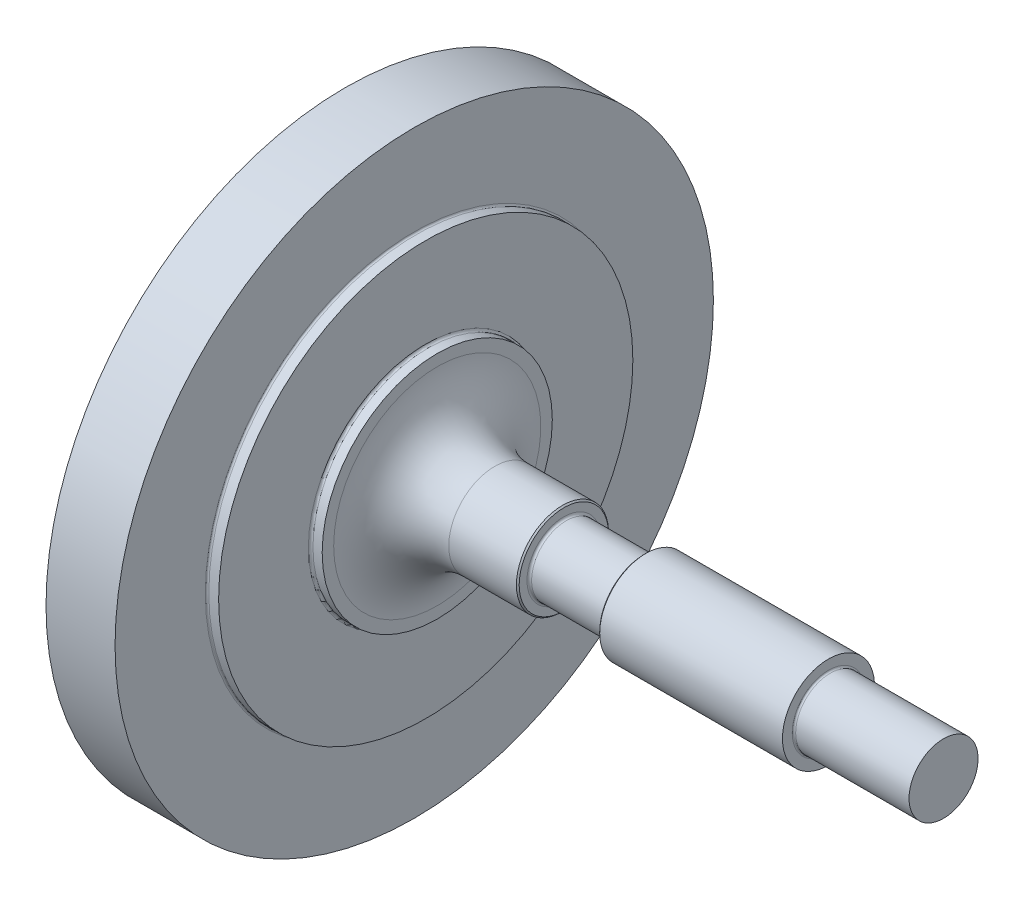
ISO-10303-21;
HEADER;
FILE_DESCRIPTION(('STEP AP214'),'2;1');
FILE_NAME('part.step','',(''),(''),'','','');
FILE_SCHEMA(('AUTOMOTIVE_DESIGN { 1 0 10303 214 1 1 1 1 }'));
ENDSEC;
DATA;
#1=APPLICATION_CONTEXT('core data for automotive mechanical design processes');
#2=APPLICATION_PROTOCOL_DEFINITION('international standard','automotive_design',2000,#1);
#3=PRODUCT_CONTEXT('',#1,'mechanical');
#4=PRODUCT('Part','Part','',(#3));
#5=PRODUCT_RELATED_PRODUCT_CATEGORY('part','',(#4));
#6=PRODUCT_DEFINITION_FORMATION('','',#4);
#7=PRODUCT_DEFINITION_CONTEXT('part definition',#1,'design');
#8=PRODUCT_DEFINITION('design','',#6,#7);
#9=PRODUCT_DEFINITION_SHAPE('','',#8);
#10=(LENGTH_UNIT() NAMED_UNIT(*) SI_UNIT(.MILLI.,.METRE.));
#11=(NAMED_UNIT(*) PLANE_ANGLE_UNIT() SI_UNIT($,.RADIAN.));
#12=(NAMED_UNIT(*) SI_UNIT($,.STERADIAN.) SOLID_ANGLE_UNIT());
#13=UNCERTAINTY_MEASURE_WITH_UNIT(LENGTH_MEASURE(1.E-05),#10,'distance_accuracy_value','');
#14=(GEOMETRIC_REPRESENTATION_CONTEXT(3) GLOBAL_UNCERTAINTY_ASSIGNED_CONTEXT((#13)) GLOBAL_UNIT_ASSIGNED_CONTEXT((#10,
#11,#12)) REPRESENTATION_CONTEXT('',''));
#15=CARTESIAN_POINT('',(0.,0.,0.));
#16=DIRECTION('',(0.,0.,1.));
#17=DIRECTION('',(1.,0.,0.));
#18=AXIS2_PLACEMENT_3D('',#15,#16,#17);
#19=CARTESIAN_POINT('',(0.,0.,0.));
#20=DIRECTION('',(-1.,0.,0.));
#21=DIRECTION('',(0.,0.,1.));
#22=AXIS2_PLACEMENT_3D('',#19,#20,#21);
#23=PLANE('',#22);
#24=CARTESIAN_POINT('',(0.,0.,0.));
#25=DIRECTION('',(-1.,0.,0.));
#26=DIRECTION('',(0.,0.,1.));
#27=AXIS2_PLACEMENT_3D('',#24,#25,#26);
#28=CIRCLE('',#27,7.61999999999998);
#29=CARTESIAN_POINT('',(0.,0.,7.61999999999998));
#30=VERTEX_POINT('',#29);
#31=EDGE_CURVE('E49',#30,#30,#28,.T.);
#32=ORIENTED_EDGE('',*,*,#31,.F.);
#33=EDGE_LOOP('',(#32));
#34=FACE_BOUND('',#33,.T.);
#35=ADVANCED_FACE('F30',(#34),#23,.F.);
#36=CARTESIAN_POINT('',(12.7,0.,0.));
#37=DIRECTION('',(-1.,0.,0.));
#38=DIRECTION('',(0.,0.,1.));
#39=AXIS2_PLACEMENT_3D('',#36,#37,#38);
#40=CYLINDRICAL_SURFACE('',#39,7.61999999999999);
#41=ORIENTED_EDGE('',*,*,#31,.T.);
#42=EDGE_LOOP('',(#41));
#43=FACE_BOUND('',#42,.T.);
#44=CARTESIAN_POINT('',(-25.019,0.,0.));
#45=DIRECTION('',(-1.,0.,0.));
#46=DIRECTION('',(0.,0.,1.));
#47=AXIS2_PLACEMENT_3D('',#44,#45,#46);
#48=CIRCLE('',#47,7.62);
#49=CARTESIAN_POINT('',(-25.019,0.,7.62));
#50=VERTEX_POINT('',#49);
#51=EDGE_CURVE('E52',#50,#50,#48,.T.);
#52=ORIENTED_EDGE('',*,*,#51,.F.);
#53=EDGE_LOOP('',(#52));
#54=FACE_BOUND('',#53,.T.);
#55=ADVANCED_FACE('F169',(#43,#54),#40,.T.);
#56=CARTESIAN_POINT('',(-25.019,0.,0.));
#57=DIRECTION('',(-1.,0.,0.));
#58=DIRECTION('',(0.,0.,1.));
#59=AXIS2_PLACEMENT_3D('',#56,#57,#58);
#60=TOROIDAL_SURFACE('',#59,8.001,0.381);
#61=ORIENTED_EDGE('',*,*,#51,.T.);
#62=EDGE_LOOP('',(#61));
#63=FACE_BOUND('',#62,.T.);
#64=CARTESIAN_POINT('',(-25.4,0.,0.));
#65=DIRECTION('',(-1.,0.,0.));
#66=DIRECTION('',(0.,0.,1.));
#67=AXIS2_PLACEMENT_3D('',#64,#65,#66);
#68=CIRCLE('',#67,8.001);
#69=CARTESIAN_POINT('',(-25.4,0.,8.001));
#70=VERTEX_POINT('',#69);
#71=EDGE_CURVE('E55',#70,#70,#68,.T.);
#72=ORIENTED_EDGE('',*,*,#71,.F.);
#73=EDGE_LOOP('',(#72));
#74=FACE_BOUND('',#73,.T.);
#75=ADVANCED_FACE('F174',(#63,#74),#60,.F.);
#76=CARTESIAN_POINT('',(-25.4,8.001,0.));
#77=DIRECTION('',(-1.,0.,0.));
#78=DIRECTION('',(0.,0.,1.));
#79=AXIS2_PLACEMENT_3D('',#76,#77,#78);
#80=PLANE('',#79);
#81=CARTESIAN_POINT('',(-25.4,0.,0.));
#82=DIRECTION('',(-1.,0.,0.));
#83=DIRECTION('',(0.,0.,1.));
#84=AXIS2_PLACEMENT_3D('',#81,#82,#83);
#85=CIRCLE('',#84,10.16);
#86=CARTESIAN_POINT('',(-25.4,0.,10.16));
#87=VERTEX_POINT('',#86);
#88=EDGE_CURVE('E58',#87,#87,#85,.T.);
#89=ORIENTED_EDGE('',*,*,#88,.F.);
#90=EDGE_LOOP('',(#89));
#91=FACE_BOUND('',#90,.T.);
#92=ORIENTED_EDGE('',*,*,#71,.T.);
#93=EDGE_LOOP('',(#92));
#94=FACE_BOUND('',#93,.T.);
#95=ADVANCED_FACE('F182',(#91,#94),#80,.F.);
#96=CARTESIAN_POINT('',(12.7,0.,0.));
#97=DIRECTION('',(-1.,0.,0.));
#98=DIRECTION('',(0.,0.,1.));
#99=AXIS2_PLACEMENT_3D('',#96,#97,#98);
#100=CYLINDRICAL_SURFACE('',#99,10.16);
#101=CARTESIAN_POINT('',(-65.7352,0.,0.));
#102=DIRECTION('',(1.,0.,0.));
#103=DIRECTION('',(0.,0.,-1.));
#104=AXIS2_PLACEMENT_3D('',#101,#102,#103);
#105=CIRCLE('',#104,10.16);
#106=CARTESIAN_POINT('',(-65.7352,0.,-10.16));
#107=VERTEX_POINT('',#106);
#108=EDGE_CURVE('E40',#107,#107,#105,.T.);
#109=ORIENTED_EDGE('',*,*,#108,.T.);
#110=EDGE_LOOP('',(#109));
#111=FACE_BOUND('',#110,.T.);
#112=ORIENTED_EDGE('',*,*,#88,.T.);
#113=EDGE_LOOP('',(#112));
#114=FACE_BOUND('',#113,.T.);
#115=ADVANCED_FACE('F187',(#111,#114),#100,.T.);
#116=CARTESIAN_POINT('',(-66.04,10.16,0.));
#117=DIRECTION('',(1.,0.,0.));
#118=DIRECTION('',(0.,0.,-1.));
#119=AXIS2_PLACEMENT_3D('',#116,#117,#118);
#120=PLANE('',#119);
#121=CARTESIAN_POINT('',(-66.04,0.,0.));
#122=DIRECTION('',(1.,0.,0.));
#123=DIRECTION('',(0.,0.,-1.));
#124=AXIS2_PLACEMENT_3D('',#121,#122,#123);
#125=CIRCLE('',#124,9.85519999999999);
#126=CARTESIAN_POINT('',(-66.04,0.,-9.85519999999999));
#127=VERTEX_POINT('',#126);
#128=EDGE_CURVE('E44',#127,#127,#125,.F.);
#129=ORIENTED_EDGE('',*,*,#128,.T.);
#130=EDGE_LOOP('',(#129));
#131=FACE_BOUND('',#130,.T.);
#132=CARTESIAN_POINT('',(-66.04,0.,0.));
#133=DIRECTION('',(-1.,0.,0.));
#134=DIRECTION('',(0.,0.,1.));
#135=AXIS2_PLACEMENT_3D('',#132,#133,#134);
#136=CIRCLE('',#135,8.12799999999998);
#137=CARTESIAN_POINT('',(-66.04,0.,8.12799999999998));
#138=VERTEX_POINT('',#137);
#139=EDGE_CURVE('E61',#138,#138,#136,.T.);
#140=ORIENTED_EDGE('',*,*,#139,.F.);
#141=EDGE_LOOP('',(#140));
#142=FACE_BOUND('',#141,.T.);
#143=ADVANCED_FACE('F193',(#131,#142),#120,.F.);
#144=CARTESIAN_POINT('',(-66.548,0.,0.));
#145=DIRECTION('',(-1.,0.,0.));
#146=DIRECTION('',(0.,0.,1.));
#147=AXIS2_PLACEMENT_3D('',#144,#145,#146);
#148=TOROIDAL_SURFACE('',#147,8.12799999999998,0.507999999999997);
#149=ORIENTED_EDGE('',*,*,#139,.T.);
#150=EDGE_LOOP('',(#149));
#151=FACE_BOUND('',#150,.T.);
#152=CARTESIAN_POINT('',(-66.548,0.,0.));
#153=DIRECTION('',(-1.,0.,0.));
#154=DIRECTION('',(0.,0.,1.));
#155=AXIS2_PLACEMENT_3D('',#152,#153,#154);
#156=CIRCLE('',#155,7.61999999999998);
#157=CARTESIAN_POINT('',(-66.548,0.,7.61999999999998));
#158=VERTEX_POINT('',#157);
#159=EDGE_CURVE('E64',#158,#158,#156,.T.);
#160=ORIENTED_EDGE('',*,*,#159,.F.);
#161=EDGE_LOOP('',(#160));
#162=FACE_BOUND('',#161,.T.);
#163=ADVANCED_FACE('F200',(#151,#162),#148,.F.);
#164=CARTESIAN_POINT('',(12.7,0.,0.));
#165=DIRECTION('',(-1.,0.,0.));
#166=DIRECTION('',(0.,0.,1.));
#167=AXIS2_PLACEMENT_3D('',#164,#165,#166);
#168=CYLINDRICAL_SURFACE('',#167,7.61999999999998);
#169=CARTESIAN_POINT('',(-83.312,0.,0.));
#170=DIRECTION('',(-1.,0.,0.));
#171=DIRECTION('',(0.,0.,1.));
#172=AXIS2_PLACEMENT_3D('',#169,#170,#171);
#173=CIRCLE('',#172,7.61999999999998);
#174=CARTESIAN_POINT('',(-83.312,0.,7.61999999999998));
#175=VERTEX_POINT('',#174);
#176=EDGE_CURVE('E67',#175,#175,#173,.T.);
#177=ORIENTED_EDGE('',*,*,#176,.F.);
#178=EDGE_LOOP('',(#177));
#179=FACE_BOUND('',#178,.T.);
#180=ORIENTED_EDGE('',*,*,#159,.T.);
#181=EDGE_LOOP('',(#180));
#182=FACE_BOUND('',#181,.T.);
#183=ADVANCED_FACE('F204',(#179,#182),#168,.T.);
#184=CARTESIAN_POINT('',(-83.312,0.,0.));
#185=DIRECTION('',(-1.,0.,0.));
#186=DIRECTION('',(0.,0.,1.));
#187=AXIS2_PLACEMENT_3D('',#184,#185,#186);
#188=TOROIDAL_SURFACE('',#187,8.12799999999998,0.507999999999997);
#189=CARTESIAN_POINT('',(-83.82,0.,0.));
#190=DIRECTION('',(-1.,0.,0.));
#191=DIRECTION('',(0.,0.,1.));
#192=AXIS2_PLACEMENT_3D('',#189,#190,#191);
#193=CIRCLE('',#192,8.12799999999998);
#194=CARTESIAN_POINT('',(-83.82,0.,8.12799999999998));
#195=VERTEX_POINT('',#194);
#196=EDGE_CURVE('E70',#195,#195,#193,.T.);
#197=ORIENTED_EDGE('',*,*,#196,.F.);
#198=EDGE_LOOP('',(#197));
#199=FACE_BOUND('',#198,.T.);
#200=ORIENTED_EDGE('',*,*,#176,.T.);
#201=EDGE_LOOP('',(#200));
#202=FACE_BOUND('',#201,.T.);
#203=ADVANCED_FACE('F208',(#199,#202),#188,.F.);
#204=CARTESIAN_POINT('',(-83.82,8.12799999999998,0.));
#205=DIRECTION('',(-1.,0.,0.));
#206=DIRECTION('',(0.,0.,1.));
#207=AXIS2_PLACEMENT_3D('',#204,#205,#206);
#208=PLANE('',#207);
#209=CARTESIAN_POINT('',(-83.82,0.,0.));
#210=DIRECTION('',(-1.,0.,0.));
#211=DIRECTION('',(0.,0.,1.));
#212=AXIS2_PLACEMENT_3D('',#209,#210,#211);
#213=CIRCLE('',#212,9.85519999999999);
#214=CARTESIAN_POINT('',(-83.82,0.,9.85519999999999));
#215=VERTEX_POINT('',#214);
#216=EDGE_CURVE('E10',#215,#215,#213,.F.);
#217=ORIENTED_EDGE('',*,*,#216,.T.);
#218=EDGE_LOOP('',(#217));
#219=FACE_BOUND('',#218,.T.);
#220=ORIENTED_EDGE('',*,*,#196,.T.);
#221=EDGE_LOOP('',(#220));
#222=FACE_BOUND('',#221,.T.);
#223=ADVANCED_FACE('F212',(#219,#222),#208,.F.);
#224=CARTESIAN_POINT('',(12.7,0.,0.));
#225=DIRECTION('',(-1.,0.,0.));
#226=DIRECTION('',(0.,0.,1.));
#227=AXIS2_PLACEMENT_3D('',#224,#225,#226);
#228=CYLINDRICAL_SURFACE('',#227,10.16);
#229=CARTESIAN_POINT('',(-84.1248,0.,0.));
#230=DIRECTION('',(-1.,0.,0.));
#231=DIRECTION('',(0.,0.,1.));
#232=AXIS2_PLACEMENT_3D('',#229,#230,#231);
#233=CIRCLE('',#232,10.16);
#234=CARTESIAN_POINT('',(-84.1248,0.,10.16));
#235=VERTEX_POINT('',#234);
#236=EDGE_CURVE('E36',#235,#235,#233,.T.);
#237=ORIENTED_EDGE('',*,*,#236,.T.);
#238=EDGE_LOOP('',(#237));
#239=FACE_BOUND('',#238,.T.);
#240=CARTESIAN_POINT('',(-99.0599999999999,0.,0.));
#241=DIRECTION('',(-1.,0.,0.));
#242=DIRECTION('',(0.,0.,1.));
#243=AXIS2_PLACEMENT_3D('',#240,#241,#242);
#244=CIRCLE('',#243,10.16);
#245=CARTESIAN_POINT('',(-99.0599999999999,0.,10.16));
#246=VERTEX_POINT('',#245);
#247=EDGE_CURVE('E73',#246,#246,#244,.T.);
#248=ORIENTED_EDGE('',*,*,#247,.F.);
#249=EDGE_LOOP('',(#248));
#250=FACE_BOUND('',#249,.T.);
#251=ADVANCED_FACE('F216',(#239,#250),#228,.T.);
#252=CARTESIAN_POINT('',(-99.06,0.,0.));
#253=DIRECTION('',(-1.,0.,0.));
#254=DIRECTION('',(0.,0.,1.));
#255=AXIS2_PLACEMENT_3D('',#252,#253,#254);
#256=TOROIDAL_SURFACE('',#255,22.86,12.7);
#257=ORIENTED_EDGE('',*,*,#247,.T.);
#258=EDGE_LOOP('',(#257));
#259=FACE_BOUND('',#258,.T.);
#260=CARTESIAN_POINT('',(-111.76,0.,0.));
#261=DIRECTION('',(-1.,0.,0.));
#262=DIRECTION('',(0.,0.,1.));
#263=AXIS2_PLACEMENT_3D('',#260,#261,#262);
#264=CIRCLE('',#263,22.86);
#265=CARTESIAN_POINT('',(-111.76,0.,22.86));
#266=VERTEX_POINT('',#265);
#267=EDGE_CURVE('E76',#266,#266,#264,.T.);
#268=ORIENTED_EDGE('',*,*,#267,.F.);
#269=EDGE_LOOP('',(#268));
#270=FACE_BOUND('',#269,.T.);
#271=ADVANCED_FACE('F219',(#259,#270),#256,.F.);
#272=CARTESIAN_POINT('',(-111.76,25.4,0.));
#273=DIRECTION('',(1.,0.,0.));
#274=DIRECTION('',(0.,0.,-1.));
#275=AXIS2_PLACEMENT_3D('',#272,#273,#274);
#276=PLANE('',#275);
#277=ORIENTED_EDGE('',*,*,#267,.T.);
#278=EDGE_LOOP('',(#277));
#279=FACE_BOUND('',#278,.T.);
#280=CARTESIAN_POINT('',(-111.76,0.,0.));
#281=DIRECTION('',(-1.,0.,0.));
#282=DIRECTION('',(0.,0.,1.));
#283=AXIS2_PLACEMENT_3D('',#280,#281,#282);
#284=CIRCLE('',#283,25.4);
#285=CARTESIAN_POINT('',(-111.76,0.,25.4));
#286=VERTEX_POINT('',#285);
#287=EDGE_CURVE('E79',#286,#286,#284,.T.);
#288=ORIENTED_EDGE('',*,*,#287,.F.);
#289=EDGE_LOOP('',(#288));
#290=FACE_BOUND('',#289,.T.);
#291=ADVANCED_FACE('F222',(#279,#290),#276,.T.);
#292=CARTESIAN_POINT('',(12.7,0.,0.));
#293=DIRECTION('',(-1.,0.,0.));
#294=DIRECTION('',(0.,0.,1.));
#295=AXIS2_PLACEMENT_3D('',#292,#293,#294);
#296=CYLINDRICAL_SURFACE('',#295,25.4);
#297=CARTESIAN_POINT('',(-113.792,0.,0.));
#298=DIRECTION('',(-1.,0.,0.));
#299=DIRECTION('',(0.,0.,1.));
#300=AXIS2_PLACEMENT_3D('',#297,#298,#299);
#301=CIRCLE('',#300,25.4);
#302=CARTESIAN_POINT('',(-113.792,0.,25.4));
#303=VERTEX_POINT('',#302);
#304=EDGE_CURVE('E82',#303,#303,#301,.T.);
#305=ORIENTED_EDGE('',*,*,#304,.F.);
#306=EDGE_LOOP('',(#305));
#307=FACE_BOUND('',#306,.T.);
#308=ORIENTED_EDGE('',*,*,#287,.T.);
#309=EDGE_LOOP('',(#308));
#310=FACE_BOUND('',#309,.T.);
#311=ADVANCED_FACE('F226',(#307,#310),#296,.T.);
#312=CARTESIAN_POINT('',(-113.792,0.,0.));
#313=DIRECTION('',(-1.,0.,0.));
#314=DIRECTION('',(0.,0.,1.));
#315=AXIS2_PLACEMENT_3D('',#312,#313,#314);
#316=TOROIDAL_SURFACE('',#315,25.908,0.507999999999998);
#317=ORIENTED_EDGE('',*,*,#304,.T.);
#318=EDGE_LOOP('',(#317));
#319=FACE_BOUND('',#318,.T.);
#320=CARTESIAN_POINT('',(-114.3,0.,0.));
#321=DIRECTION('',(-1.,0.,0.));
#322=DIRECTION('',(0.,0.,1.));
#323=AXIS2_PLACEMENT_3D('',#320,#321,#322);
#324=CIRCLE('',#323,25.908);
#325=CARTESIAN_POINT('',(-114.3,0.,25.908));
#326=VERTEX_POINT('',#325);
#327=EDGE_CURVE('E85',#326,#326,#324,.T.);
#328=ORIENTED_EDGE('',*,*,#327,.F.);
#329=EDGE_LOOP('',(#328));
#330=FACE_BOUND('',#329,.T.);
#331=ADVANCED_FACE('F230',(#319,#330),#316,.F.);
#332=CARTESIAN_POINT('',(-114.3,25.908,0.));
#333=DIRECTION('',(-1.,0.,0.));
#334=DIRECTION('',(0.,0.,1.));
#335=AXIS2_PLACEMENT_3D('',#332,#333,#334);
#336=PLANE('',#335);
#337=CARTESIAN_POINT('',(-114.3,0.,0.));
#338=DIRECTION('',(-1.,0.,0.));
#339=DIRECTION('',(0.,0.,1.));
#340=AXIS2_PLACEMENT_3D('',#337,#338,#339);
#341=CIRCLE('',#340,45.72);
#342=CARTESIAN_POINT('',(-114.3,0.,45.72));
#343=VERTEX_POINT('',#342);
#344=EDGE_CURVE('E88',#343,#343,#341,.T.);
#345=ORIENTED_EDGE('',*,*,#344,.F.);
#346=EDGE_LOOP('',(#345));
#347=FACE_BOUND('',#346,.T.);
#348=ORIENTED_EDGE('',*,*,#327,.T.);
#349=EDGE_LOOP('',(#348));
#350=FACE_BOUND('',#349,.T.);
#351=ADVANCED_FACE('F234',(#347,#350),#336,.F.);
#352=CARTESIAN_POINT('',(12.7,0.,0.));
#353=DIRECTION('',(-1.,0.,0.));
#354=DIRECTION('',(0.,0.,1.));
#355=AXIS2_PLACEMENT_3D('',#352,#353,#354);
#356=CYLINDRICAL_SURFACE('',#355,45.72);
#357=CARTESIAN_POINT('',(-116.459,0.,0.));
#358=DIRECTION('',(-1.,0.,0.));
#359=DIRECTION('',(0.,0.,1.));
#360=AXIS2_PLACEMENT_3D('',#357,#358,#359);
#361=CIRCLE('',#360,45.72);
#362=CARTESIAN_POINT('',(-116.459,0.,45.72));
#363=VERTEX_POINT('',#362);
#364=EDGE_CURVE('E91',#363,#363,#361,.T.);
#365=ORIENTED_EDGE('',*,*,#364,.F.);
#366=EDGE_LOOP('',(#365));
#367=FACE_BOUND('',#366,.T.);
#368=ORIENTED_EDGE('',*,*,#344,.T.);
#369=EDGE_LOOP('',(#368));
#370=FACE_BOUND('',#369,.T.);
#371=ADVANCED_FACE('F238',(#367,#370),#356,.T.);
#372=CARTESIAN_POINT('',(-116.459,0.,0.));
#373=DIRECTION('',(-1.,0.,0.));
#374=DIRECTION('',(0.,0.,1.));
#375=AXIS2_PLACEMENT_3D('',#372,#373,#374);
#376=TOROIDAL_SURFACE('',#375,46.101,0.381000000000003);
#377=CARTESIAN_POINT('',(-116.84,0.,0.));
#378=DIRECTION('',(-1.,0.,0.));
#379=DIRECTION('',(0.,0.,1.));
#380=AXIS2_PLACEMENT_3D('',#377,#378,#379);
#381=CIRCLE('',#380,46.101);
#382=CARTESIAN_POINT('',(-116.84,0.,46.101));
#383=VERTEX_POINT('',#382);
#384=EDGE_CURVE('E94',#383,#383,#381,.T.);
#385=ORIENTED_EDGE('',*,*,#384,.F.);
#386=EDGE_LOOP('',(#385));
#387=FACE_BOUND('',#386,.T.);
#388=ORIENTED_EDGE('',*,*,#364,.T.);
#389=EDGE_LOOP('',(#388));
#390=FACE_BOUND('',#389,.T.);
#391=ADVANCED_FACE('F242',(#387,#390),#376,.F.);
#392=CARTESIAN_POINT('',(-116.84,46.101,0.));
#393=DIRECTION('',(-1.,0.,0.));
#394=DIRECTION('',(0.,0.,1.));
#395=AXIS2_PLACEMENT_3D('',#392,#393,#394);
#396=PLANE('',#395);
#397=CARTESIAN_POINT('',(-116.84,0.,0.));
#398=DIRECTION('',(-1.,0.,0.));
#399=DIRECTION('',(0.,0.,1.));
#400=AXIS2_PLACEMENT_3D('',#397,#398,#399);
#401=CIRCLE('',#400,66.04);
#402=CARTESIAN_POINT('',(-116.84,0.,66.04));
#403=VERTEX_POINT('',#402);
#404=EDGE_CURVE('E97',#403,#403,#401,.T.);
#405=ORIENTED_EDGE('',*,*,#404,.F.);
#406=EDGE_LOOP('',(#405));
#407=FACE_BOUND('',#406,.T.);
#408=ORIENTED_EDGE('',*,*,#384,.T.);
#409=EDGE_LOOP('',(#408));
#410=FACE_BOUND('',#409,.T.);
#411=ADVANCED_FACE('F246',(#407,#410),#396,.F.);
#412=CARTESIAN_POINT('',(12.7,0.,0.));
#413=DIRECTION('',(-1.,0.,0.));
#414=DIRECTION('',(0.,0.,1.));
#415=AXIS2_PLACEMENT_3D('',#412,#413,#414);
#416=CYLINDRICAL_SURFACE('',#415,66.04);
#417=CARTESIAN_POINT('',(-132.08,0.,0.));
#418=DIRECTION('',(-1.,0.,0.));
#419=DIRECTION('',(0.,0.,1.));
#420=AXIS2_PLACEMENT_3D('',#417,#418,#419);
#421=CIRCLE('',#420,66.04);
#422=CARTESIAN_POINT('',(-132.08,0.,66.04));
#423=VERTEX_POINT('',#422);
#424=EDGE_CURVE('E100',#423,#423,#421,.T.);
#425=ORIENTED_EDGE('',*,*,#424,.F.);
#426=EDGE_LOOP('',(#425));
#427=FACE_BOUND('',#426,.T.);
#428=ORIENTED_EDGE('',*,*,#404,.T.);
#429=EDGE_LOOP('',(#428));
#430=FACE_BOUND('',#429,.T.);
#431=ADVANCED_FACE('F250',(#427,#430),#416,.T.);
#432=CARTESIAN_POINT('',(-132.08,66.04,0.));
#433=DIRECTION('',(1.,0.,0.));
#434=DIRECTION('',(0.,0.,-1.));
#435=AXIS2_PLACEMENT_3D('',#432,#433,#434);
#436=PLANE('',#435);
#437=CARTESIAN_POINT('',(-132.08,0.,0.));
#438=DIRECTION('',(-1.,0.,0.));
#439=DIRECTION('',(0.,0.,1.));
#440=AXIS2_PLACEMENT_3D('',#437,#438,#439);
#441=CIRCLE('',#440,46.228);
#442=CARTESIAN_POINT('',(-132.08,0.,46.228));
#443=VERTEX_POINT('',#442);
#444=EDGE_CURVE('E103',#443,#443,#441,.T.);
#445=ORIENTED_EDGE('',*,*,#444,.F.);
#446=EDGE_LOOP('',(#445));
#447=FACE_BOUND('',#446,.T.);
#448=ORIENTED_EDGE('',*,*,#424,.T.);
#449=EDGE_LOOP('',(#448));
#450=FACE_BOUND('',#449,.T.);
#451=ADVANCED_FACE('F254',(#447,#450),#436,.F.);
#452=CARTESIAN_POINT('',(-132.588,0.,0.));
#453=DIRECTION('',(-1.,0.,0.));
#454=DIRECTION('',(0.,0.,1.));
#455=AXIS2_PLACEMENT_3D('',#452,#453,#454);
#456=TOROIDAL_SURFACE('',#455,46.228,0.508000000000005);
#457=ORIENTED_EDGE('',*,*,#444,.T.);
#458=EDGE_LOOP('',(#457));
#459=FACE_BOUND('',#458,.T.);
#460=CARTESIAN_POINT('',(-132.588,0.,0.));
#461=DIRECTION('',(-1.,0.,0.));
#462=DIRECTION('',(0.,0.,1.));
#463=AXIS2_PLACEMENT_3D('',#460,#461,#462);
#464=CIRCLE('',#463,45.72);
#465=CARTESIAN_POINT('',(-132.588,0.,45.72));
#466=VERTEX_POINT('',#465);
#467=EDGE_CURVE('E106',#466,#466,#464,.T.);
#468=ORIENTED_EDGE('',*,*,#467,.F.);
#469=EDGE_LOOP('',(#468));
#470=FACE_BOUND('',#469,.T.);
#471=ADVANCED_FACE('F258',(#459,#470),#456,.F.);
#472=CARTESIAN_POINT('',(12.7,0.,0.));
#473=DIRECTION('',(-1.,0.,0.));
#474=DIRECTION('',(0.,0.,1.));
#475=AXIS2_PLACEMENT_3D('',#472,#473,#474);
#476=CYLINDRICAL_SURFACE('',#475,45.72);
#477=CARTESIAN_POINT('',(-134.62,0.,0.));
#478=DIRECTION('',(-1.,0.,0.));
#479=DIRECTION('',(0.,0.,1.));
#480=AXIS2_PLACEMENT_3D('',#477,#478,#479);
#481=CIRCLE('',#480,45.72);
#482=CARTESIAN_POINT('',(-134.62,0.,45.72));
#483=VERTEX_POINT('',#482);
#484=EDGE_CURVE('E109',#483,#483,#481,.T.);
#485=ORIENTED_EDGE('',*,*,#484,.F.);
#486=EDGE_LOOP('',(#485));
#487=FACE_BOUND('',#486,.T.);
#488=ORIENTED_EDGE('',*,*,#467,.T.);
#489=EDGE_LOOP('',(#488));
#490=FACE_BOUND('',#489,.T.);
#491=ADVANCED_FACE('F165',(#487,#490),#476,.T.);
#492=CARTESIAN_POINT('',(-134.62,45.72,0.));
#493=DIRECTION('',(1.,0.,0.));
#494=DIRECTION('',(0.,0.,-1.));
#495=AXIS2_PLACEMENT_3D('',#492,#493,#494);
#496=PLANE('',#495);
#497=CARTESIAN_POINT('',(-134.62,0.,0.));
#498=DIRECTION('',(-1.,0.,0.));
#499=DIRECTION('',(0.,0.,1.));
#500=AXIS2_PLACEMENT_3D('',#497,#498,#499);
#501=CIRCLE('',#500,25.908);
#502=CARTESIAN_POINT('',(-134.62,0.,25.908));
#503=VERTEX_POINT('',#502);
#504=EDGE_CURVE('E112',#503,#503,#501,.T.);
#505=ORIENTED_EDGE('',*,*,#504,.F.);
#506=EDGE_LOOP('',(#505));
#507=FACE_BOUND('',#506,.T.);
#508=ORIENTED_EDGE('',*,*,#484,.T.);
#509=EDGE_LOOP('',(#508));
#510=FACE_BOUND('',#509,.T.);
#511=ADVANCED_FACE('F159',(#507,#510),#496,.F.);
#512=CARTESIAN_POINT('',(-135.128,0.,0.));
#513=DIRECTION('',(-1.,0.,0.));
#514=DIRECTION('',(0.,0.,1.));
#515=AXIS2_PLACEMENT_3D('',#512,#513,#514);
#516=TOROIDAL_SURFACE('',#515,25.908,0.508000000000005);
#517=ORIENTED_EDGE('',*,*,#504,.T.);
#518=EDGE_LOOP('',(#517));
#519=FACE_BOUND('',#518,.T.);
#520=CARTESIAN_POINT('',(-135.128,0.,0.));
#521=DIRECTION('',(-1.,0.,0.));
#522=DIRECTION('',(0.,0.,1.));
#523=AXIS2_PLACEMENT_3D('',#520,#521,#522);
#524=CIRCLE('',#523,25.4);
#525=CARTESIAN_POINT('',(-135.128,0.,25.4));
#526=VERTEX_POINT('',#525);
#527=EDGE_CURVE('E115',#526,#526,#524,.T.);
#528=ORIENTED_EDGE('',*,*,#527,.F.);
#529=EDGE_LOOP('',(#528));
#530=FACE_BOUND('',#529,.T.);
#531=ADVANCED_FACE('F154',(#519,#530),#516,.F.);
#532=CARTESIAN_POINT('',(12.7,0.,0.));
#533=DIRECTION('',(-1.,0.,0.));
#534=DIRECTION('',(0.,0.,1.));
#535=AXIS2_PLACEMENT_3D('',#532,#533,#534);
#536=CYLINDRICAL_SURFACE('',#535,25.4);
#537=CARTESIAN_POINT('',(-137.16,0.,0.));
#538=DIRECTION('',(-1.,0.,0.));
#539=DIRECTION('',(0.,0.,1.));
#540=AXIS2_PLACEMENT_3D('',#537,#538,#539);
#541=CIRCLE('',#540,25.4);
#542=CARTESIAN_POINT('',(-137.16,0.,25.4));
#543=VERTEX_POINT('',#542);
#544=EDGE_CURVE('E118',#543,#543,#541,.T.);
#545=ORIENTED_EDGE('',*,*,#544,.F.);
#546=EDGE_LOOP('',(#545));
#547=FACE_BOUND('',#546,.T.);
#548=ORIENTED_EDGE('',*,*,#527,.T.);
#549=EDGE_LOOP('',(#548));
#550=FACE_BOUND('',#549,.T.);
#551=ADVANCED_FACE('F148',(#547,#550),#536,.T.);
#552=CARTESIAN_POINT('',(-137.16,25.4,0.));
#553=DIRECTION('',(1.,0.,0.));
#554=DIRECTION('',(0.,0.,-1.));
#555=AXIS2_PLACEMENT_3D('',#552,#553,#554);
#556=PLANE('',#555);
#557=CARTESIAN_POINT('',(-137.16,0.,0.));
#558=DIRECTION('',(-1.,0.,0.));
#559=DIRECTION('',(0.,0.,1.));
#560=AXIS2_PLACEMENT_3D('',#557,#558,#559);
#561=CIRCLE('',#560,8.12799999999998);
#562=CARTESIAN_POINT('',(-137.16,0.,8.12799999999998));
#563=VERTEX_POINT('',#562);
#564=EDGE_CURVE('E121',#563,#563,#561,.T.);
#565=ORIENTED_EDGE('',*,*,#564,.F.);
#566=EDGE_LOOP('',(#565));
#567=FACE_BOUND('',#566,.T.);
#568=ORIENTED_EDGE('',*,*,#544,.T.);
#569=EDGE_LOOP('',(#568));
#570=FACE_BOUND('',#569,.T.);
#571=ADVANCED_FACE('F142',(#567,#570),#556,.F.);
#572=CARTESIAN_POINT('',(-137.668,0.,0.));
#573=DIRECTION('',(-1.,0.,0.));
#574=DIRECTION('',(0.,0.,1.));
#575=AXIS2_PLACEMENT_3D('',#572,#573,#574);
#576=TOROIDAL_SURFACE('',#575,8.12799999999998,0.508000000000004);
#577=CARTESIAN_POINT('',(-137.668,0.,0.));
#578=DIRECTION('',(-1.,0.,0.));
#579=DIRECTION('',(0.,0.,1.));
#580=AXIS2_PLACEMENT_3D('',#577,#578,#579);
#581=CIRCLE('',#580,7.61999999999998);
#582=CARTESIAN_POINT('',(-137.668,0.,7.61999999999998));
#583=VERTEX_POINT('',#582);
#584=EDGE_CURVE('E124',#583,#583,#581,.T.);
#585=ORIENTED_EDGE('',*,*,#584,.F.);
#586=EDGE_LOOP('',(#585));
#587=FACE_BOUND('',#586,.T.);
#588=ORIENTED_EDGE('',*,*,#564,.T.);
#589=EDGE_LOOP('',(#588));
#590=FACE_BOUND('',#589,.T.);
#591=ADVANCED_FACE('F136',(#587,#590),#576,.F.);
#592=CARTESIAN_POINT('',(12.7,0.,0.));
#593=DIRECTION('',(-1.,0.,0.));
#594=DIRECTION('',(0.,0.,1.));
#595=AXIS2_PLACEMENT_3D('',#592,#593,#594);
#596=CYLINDRICAL_SURFACE('',#595,7.61999999999998);
#597=CARTESIAN_POINT('',(-142.24,0.,0.));
#598=DIRECTION('',(-1.,0.,0.));
#599=DIRECTION('',(0.,0.,1.));
#600=AXIS2_PLACEMENT_3D('',#597,#598,#599);
#601=CIRCLE('',#600,7.61999999999998);
#602=CARTESIAN_POINT('',(-142.24,0.,7.61999999999998));
#603=VERTEX_POINT('',#602);
#604=EDGE_CURVE('E127',#603,#603,#601,.T.);
#605=ORIENTED_EDGE('',*,*,#604,.F.);
#606=EDGE_LOOP('',(#605));
#607=FACE_BOUND('',#606,.T.);
#608=ORIENTED_EDGE('',*,*,#584,.T.);
#609=EDGE_LOOP('',(#608));
#610=FACE_BOUND('',#609,.T.);
#611=ADVANCED_FACE('F133',(#607,#610),#596,.T.);
#612=CARTESIAN_POINT('',(-142.24,7.61999999999998,0.));
#613=DIRECTION('',(1.,0.,0.));
#614=DIRECTION('',(0.,0.,-1.));
#615=AXIS2_PLACEMENT_3D('',#612,#613,#614);
#616=PLANE('',#615);
#617=ORIENTED_EDGE('',*,*,#604,.T.);
#618=EDGE_LOOP('',(#617));
#619=FACE_BOUND('',#618,.T.);
#620=ADVANCED_FACE('F131',(#619),#616,.F.);
#621=CARTESIAN_POINT('',(-66.04,0.,0.));
#622=DIRECTION('',(1.,0.,0.));
#623=DIRECTION('',(0.,0.,-1.));
#624=AXIS2_PLACEMENT_3D('',#621,#622,#623);
#625=CONICAL_SURFACE('',#624,9.85519999999999,0.785398163397445);
#626=ORIENTED_EDGE('',*,*,#108,.F.);
#627=EDGE_LOOP('',(#626));
#628=FACE_BOUND('',#627,.T.);
#629=ORIENTED_EDGE('',*,*,#128,.F.);
#630=EDGE_LOOP('',(#629));
#631=FACE_BOUND('',#630,.T.);
#632=ADVANCED_FACE('F315',(#628,#631),#625,.T.);
#633=CARTESIAN_POINT('',(-84.1248,0.,0.));
#634=DIRECTION('',(-1.,0.,0.));
#635=DIRECTION('',(0.,0.,1.));
#636=AXIS2_PLACEMENT_3D('',#633,#634,#635);
#637=CONICAL_SURFACE('',#636,10.16,0.78539816339744);
#638=ORIENTED_EDGE('',*,*,#216,.F.);
#639=EDGE_LOOP('',(#638));
#640=FACE_BOUND('',#639,.T.);
#641=ORIENTED_EDGE('',*,*,#236,.F.);
#642=EDGE_LOOP('',(#641));
#643=FACE_BOUND('',#642,.T.);
#644=ADVANCED_FACE('F324',(#640,#643),#637,.T.);
#645=CLOSED_SHELL('',(#35,#55,#75,#95,#115,#143,#163,#183,#203,#223,#251,#271,#291,#311,#331,
#351,#371,#391,#411,#431,#451,#471,#491,#511,#531,#551,#571,#591,#611,#620,#632,#644));
#646=MANIFOLD_SOLID_BREP('B2',#645);
#647=ADVANCED_BREP_SHAPE_REPRESENTATION('',(#18,#646),#14);
#648=SHAPE_DEFINITION_REPRESENTATION(#9,#647);
ENDSEC;
END-ISO-10303-21;
